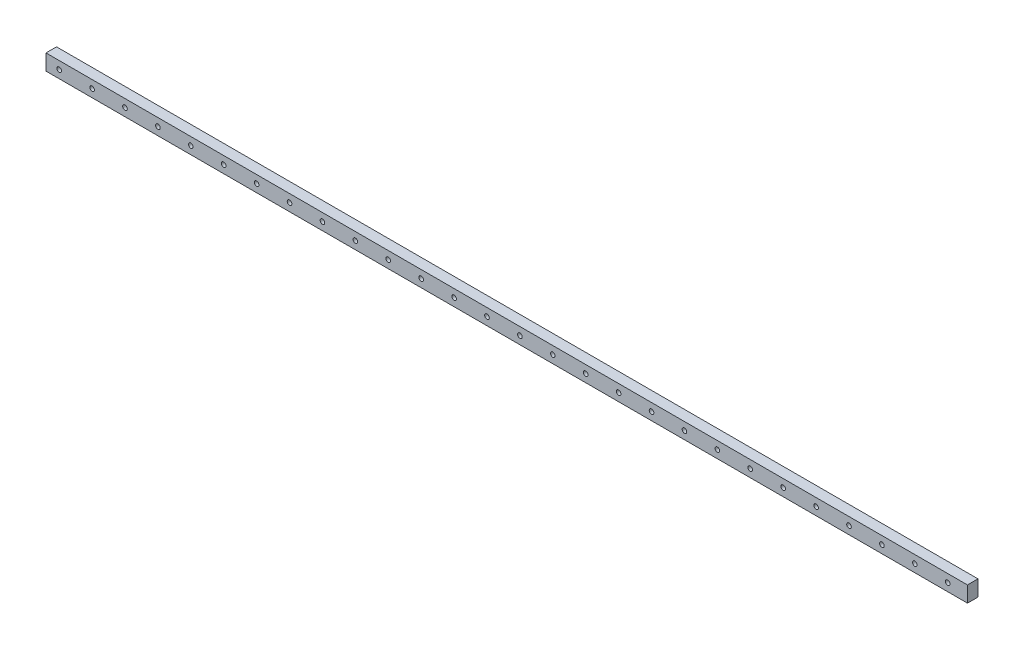
ISO-10303-21;
HEADER;
FILE_DESCRIPTION(('STEP AP214'),'2;1');
FILE_NAME('part.step','',(''),(''),'','','');
FILE_SCHEMA(('AUTOMOTIVE_DESIGN { 1 0 10303 214 1 1 1 1 }'));
ENDSEC;
DATA;
#1=APPLICATION_CONTEXT('core data for automotive mechanical design processes');
#2=APPLICATION_PROTOCOL_DEFINITION('international standard','automotive_design',2000,#1);
#3=PRODUCT_CONTEXT('',#1,'mechanical');
#4=PRODUCT('Part','Part','',(#3));
#5=PRODUCT_RELATED_PRODUCT_CATEGORY('part','',(#4));
#6=PRODUCT_DEFINITION_FORMATION('','',#4);
#7=PRODUCT_DEFINITION_CONTEXT('part definition',#1,'design');
#8=PRODUCT_DEFINITION('design','',#6,#7);
#9=PRODUCT_DEFINITION_SHAPE('','',#8);
#10=(LENGTH_UNIT() NAMED_UNIT(*) SI_UNIT(.MILLI.,.METRE.));
#11=(NAMED_UNIT(*) PLANE_ANGLE_UNIT() SI_UNIT($,.RADIAN.));
#12=(NAMED_UNIT(*) SI_UNIT($,.STERADIAN.) SOLID_ANGLE_UNIT());
#13=UNCERTAINTY_MEASURE_WITH_UNIT(LENGTH_MEASURE(1.E-05),#10,'distance_accuracy_value','');
#14=(GEOMETRIC_REPRESENTATION_CONTEXT(3) GLOBAL_UNCERTAINTY_ASSIGNED_CONTEXT((#13)) GLOBAL_UNIT_ASSIGNED_CONTEXT((#10,
#11,#12)) REPRESENTATION_CONTEXT('',''));
#15=CARTESIAN_POINT('',(0.,0.,0.));
#16=DIRECTION('',(0.,0.,1.));
#17=DIRECTION('',(1.,0.,0.));
#18=AXIS2_PLACEMENT_3D('',#15,#16,#17);
#19=CARTESIAN_POINT('',(335.,0.,-1.));
#20=DIRECTION('',(0.,0.,1.));
#21=DIRECTION('',(0.,-1.,0.));
#22=AXIS2_PLACEMENT_3D('',#19,#20,#21);
#23=CYLINDRICAL_SURFACE('',#22,1.75);
#24=CARTESIAN_POINT('',(335.,0.,8.));
#25=DIRECTION('',(0.,0.,1.));
#26=DIRECTION('',(0.,-1.,0.));
#27=AXIS2_PLACEMENT_3D('',#24,#25,#26);
#28=CIRCLE('',#27,1.75);
#29=CARTESIAN_POINT('',(335.,-1.74999999999996,8.));
#30=VERTEX_POINT('',#29);
#31=EDGE_CURVE('E77',#30,#30,#28,.T.);
#32=ORIENTED_EDGE('',*,*,#31,.T.);
#33=EDGE_LOOP('',(#32));
#34=FACE_BOUND('',#33,.T.);
#35=CARTESIAN_POINT('',(335.,0.,0.));
#36=DIRECTION('',(0.,0.,1.));
#37=DIRECTION('',(0.,-1.,0.));
#38=AXIS2_PLACEMENT_3D('',#35,#36,#37);
#39=CIRCLE('',#38,1.75);
#40=CARTESIAN_POINT('',(335.,-1.74999999999996,0.));
#41=VERTEX_POINT('',#40);
#42=EDGE_CURVE('E10',#41,#41,#39,.T.);
#43=ORIENTED_EDGE('',*,*,#42,.F.);
#44=EDGE_LOOP('',(#43));
#45=FACE_BOUND('',#44,.T.);
#46=ADVANCED_FACE('F16',(#34,#45),#23,.F.);
#47=CARTESIAN_POINT('',(310.,0.,-1.));
#48=DIRECTION('',(0.,0.,1.));
#49=DIRECTION('',(0.,-1.,0.));
#50=AXIS2_PLACEMENT_3D('',#47,#48,#49);
#51=CYLINDRICAL_SURFACE('',#50,1.75);
#52=CARTESIAN_POINT('',(310.,0.,8.));
#53=DIRECTION('',(0.,0.,1.));
#54=DIRECTION('',(0.,-1.,0.));
#55=AXIS2_PLACEMENT_3D('',#52,#53,#54);
#56=CIRCLE('',#55,1.75);
#57=CARTESIAN_POINT('',(310.,-1.74999999999997,8.));
#58=VERTEX_POINT('',#57);
#59=EDGE_CURVE('E232',#58,#58,#56,.T.);
#60=ORIENTED_EDGE('',*,*,#59,.T.);
#61=EDGE_LOOP('',(#60));
#62=FACE_BOUND('',#61,.T.);
#63=CARTESIAN_POINT('',(310.,0.,0.));
#64=DIRECTION('',(0.,0.,1.));
#65=DIRECTION('',(0.,-1.,0.));
#66=AXIS2_PLACEMENT_3D('',#63,#64,#65);
#67=CIRCLE('',#66,1.75);
#68=CARTESIAN_POINT('',(310.,-1.74999999999997,0.));
#69=VERTEX_POINT('',#68);
#70=EDGE_CURVE('E24',#69,#69,#67,.T.);
#71=ORIENTED_EDGE('',*,*,#70,.F.);
#72=EDGE_LOOP('',(#71));
#73=FACE_BOUND('',#72,.T.);
#74=ADVANCED_FACE('F335',(#62,#73),#51,.F.);
#75=CARTESIAN_POINT('',(285.,0.,-1.));
#76=DIRECTION('',(0.,0.,1.));
#77=DIRECTION('',(0.,-1.,0.));
#78=AXIS2_PLACEMENT_3D('',#75,#76,#77);
#79=CYLINDRICAL_SURFACE('',#78,1.75);
#80=CARTESIAN_POINT('',(285.,0.,8.));
#81=DIRECTION('',(0.,0.,1.));
#82=DIRECTION('',(0.,-1.,0.));
#83=AXIS2_PLACEMENT_3D('',#80,#81,#82);
#84=CIRCLE('',#83,1.75);
#85=CARTESIAN_POINT('',(285.,-1.74999999999997,8.));
#86=VERTEX_POINT('',#85);
#87=EDGE_CURVE('E228',#86,#86,#84,.T.);
#88=ORIENTED_EDGE('',*,*,#87,.T.);
#89=EDGE_LOOP('',(#88));
#90=FACE_BOUND('',#89,.T.);
#91=CARTESIAN_POINT('',(285.,0.,0.));
#92=DIRECTION('',(0.,0.,1.));
#93=DIRECTION('',(0.,-1.,0.));
#94=AXIS2_PLACEMENT_3D('',#91,#92,#93);
#95=CIRCLE('',#94,1.75);
#96=CARTESIAN_POINT('',(285.,-1.74999999999997,0.));
#97=VERTEX_POINT('',#96);
#98=EDGE_CURVE('E147',#97,#97,#95,.T.);
#99=ORIENTED_EDGE('',*,*,#98,.F.);
#100=EDGE_LOOP('',(#99));
#101=FACE_BOUND('',#100,.T.);
#102=ADVANCED_FACE('F337',(#90,#101),#79,.F.);
#103=CARTESIAN_POINT('',(260.,0.,-1.));
#104=DIRECTION('',(0.,0.,1.));
#105=DIRECTION('',(0.,-1.,0.));
#106=AXIS2_PLACEMENT_3D('',#103,#104,#105);
#107=CYLINDRICAL_SURFACE('',#106,1.75);
#108=CARTESIAN_POINT('',(260.,0.,8.));
#109=DIRECTION('',(0.,0.,1.));
#110=DIRECTION('',(0.,-1.,0.));
#111=AXIS2_PLACEMENT_3D('',#108,#109,#110);
#112=CIRCLE('',#111,1.75);
#113=CARTESIAN_POINT('',(260.,-1.74999999999997,8.));
#114=VERTEX_POINT('',#113);
#115=EDGE_CURVE('E233',#114,#114,#112,.T.);
#116=ORIENTED_EDGE('',*,*,#115,.T.);
#117=EDGE_LOOP('',(#116));
#118=FACE_BOUND('',#117,.T.);
#119=CARTESIAN_POINT('',(260.,0.,0.));
#120=DIRECTION('',(0.,0.,1.));
#121=DIRECTION('',(0.,-1.,0.));
#122=AXIS2_PLACEMENT_3D('',#119,#120,#121);
#123=CIRCLE('',#122,1.75);
#124=CARTESIAN_POINT('',(260.,-1.74999999999997,0.));
#125=VERTEX_POINT('',#124);
#126=EDGE_CURVE('E151',#125,#125,#123,.T.);
#127=ORIENTED_EDGE('',*,*,#126,.F.);
#128=EDGE_LOOP('',(#127));
#129=FACE_BOUND('',#128,.T.);
#130=ADVANCED_FACE('F344',(#118,#129),#107,.F.);
#131=CARTESIAN_POINT('',(235.,0.,-1.));
#132=DIRECTION('',(0.,0.,1.));
#133=DIRECTION('',(0.,-1.,0.));
#134=AXIS2_PLACEMENT_3D('',#131,#132,#133);
#135=CYLINDRICAL_SURFACE('',#134,1.75);
#136=CARTESIAN_POINT('',(235.,0.,8.));
#137=DIRECTION('',(0.,0.,1.));
#138=DIRECTION('',(0.,-1.,0.));
#139=AXIS2_PLACEMENT_3D('',#136,#137,#138);
#140=CIRCLE('',#139,1.75);
#141=CARTESIAN_POINT('',(235.,-1.74999999999997,8.));
#142=VERTEX_POINT('',#141);
#143=EDGE_CURVE('E250',#142,#142,#140,.T.);
#144=ORIENTED_EDGE('',*,*,#143,.T.);
#145=EDGE_LOOP('',(#144));
#146=FACE_BOUND('',#145,.T.);
#147=CARTESIAN_POINT('',(235.,0.,0.));
#148=DIRECTION('',(0.,0.,1.));
#149=DIRECTION('',(0.,-1.,0.));
#150=AXIS2_PLACEMENT_3D('',#147,#148,#149);
#151=CIRCLE('',#150,1.75);
#152=CARTESIAN_POINT('',(235.,-1.74999999999997,0.));
#153=VERTEX_POINT('',#152);
#154=EDGE_CURVE('E216',#153,#153,#151,.T.);
#155=ORIENTED_EDGE('',*,*,#154,.F.);
#156=EDGE_LOOP('',(#155));
#157=FACE_BOUND('',#156,.T.);
#158=ADVANCED_FACE('F351',(#146,#157),#135,.F.);
#159=CARTESIAN_POINT('',(210.,0.,-1.));
#160=DIRECTION('',(0.,0.,1.));
#161=DIRECTION('',(0.,-1.,0.));
#162=AXIS2_PLACEMENT_3D('',#159,#160,#161);
#163=CYLINDRICAL_SURFACE('',#162,1.75);
#164=CARTESIAN_POINT('',(210.,0.,8.));
#165=DIRECTION('',(0.,0.,1.));
#166=DIRECTION('',(0.,-1.,0.));
#167=AXIS2_PLACEMENT_3D('',#164,#165,#166);
#168=CIRCLE('',#167,1.75);
#169=CARTESIAN_POINT('',(210.,-1.74999999999998,8.));
#170=VERTEX_POINT('',#169);
#171=EDGE_CURVE('E246',#170,#170,#168,.T.);
#172=ORIENTED_EDGE('',*,*,#171,.T.);
#173=EDGE_LOOP('',(#172));
#174=FACE_BOUND('',#173,.T.);
#175=CARTESIAN_POINT('',(210.,0.,0.));
#176=DIRECTION('',(0.,0.,1.));
#177=DIRECTION('',(0.,-1.,0.));
#178=AXIS2_PLACEMENT_3D('',#175,#176,#177);
#179=CIRCLE('',#178,1.75);
#180=CARTESIAN_POINT('',(210.,-1.74999999999998,0.));
#181=VERTEX_POINT('',#180);
#182=EDGE_CURVE('E163',#181,#181,#179,.T.);
#183=ORIENTED_EDGE('',*,*,#182,.F.);
#184=EDGE_LOOP('',(#183));
#185=FACE_BOUND('',#184,.T.);
#186=ADVANCED_FACE('F355',(#174,#185),#163,.F.);
#187=CARTESIAN_POINT('',(185.,0.,-1.));
#188=DIRECTION('',(0.,0.,1.));
#189=DIRECTION('',(0.,-1.,0.));
#190=AXIS2_PLACEMENT_3D('',#187,#188,#189);
#191=CYLINDRICAL_SURFACE('',#190,1.75);
#192=CARTESIAN_POINT('',(185.,0.,8.));
#193=DIRECTION('',(0.,0.,1.));
#194=DIRECTION('',(0.,-1.,0.));
#195=AXIS2_PLACEMENT_3D('',#192,#193,#194);
#196=CIRCLE('',#195,1.75);
#197=CARTESIAN_POINT('',(185.,-1.74999999999998,8.));
#198=VERTEX_POINT('',#197);
#199=EDGE_CURVE('E242',#198,#198,#196,.T.);
#200=ORIENTED_EDGE('',*,*,#199,.T.);
#201=EDGE_LOOP('',(#200));
#202=FACE_BOUND('',#201,.T.);
#203=CARTESIAN_POINT('',(185.,0.,0.));
#204=DIRECTION('',(0.,0.,1.));
#205=DIRECTION('',(0.,-1.,0.));
#206=AXIS2_PLACEMENT_3D('',#203,#204,#205);
#207=CIRCLE('',#206,1.75);
#208=CARTESIAN_POINT('',(185.,-1.74999999999998,0.));
#209=VERTEX_POINT('',#208);
#210=EDGE_CURVE('E133',#209,#209,#207,.T.);
#211=ORIENTED_EDGE('',*,*,#210,.F.);
#212=EDGE_LOOP('',(#211));
#213=FACE_BOUND('',#212,.T.);
#214=ADVANCED_FACE('F359',(#202,#213),#191,.F.);
#215=CARTESIAN_POINT('',(160.,0.,-1.));
#216=DIRECTION('',(0.,0.,1.));
#217=DIRECTION('',(0.,-1.,0.));
#218=AXIS2_PLACEMENT_3D('',#215,#216,#217);
#219=CYLINDRICAL_SURFACE('',#218,1.75);
#220=CARTESIAN_POINT('',(160.,0.,8.));
#221=DIRECTION('',(0.,0.,1.));
#222=DIRECTION('',(0.,-1.,0.));
#223=AXIS2_PLACEMENT_3D('',#220,#221,#222);
#224=CIRCLE('',#223,1.75);
#225=CARTESIAN_POINT('',(160.,-1.74999999999998,8.));
#226=VERTEX_POINT('',#225);
#227=EDGE_CURVE('E241',#226,#226,#224,.T.);
#228=ORIENTED_EDGE('',*,*,#227,.T.);
#229=EDGE_LOOP('',(#228));
#230=FACE_BOUND('',#229,.T.);
#231=CARTESIAN_POINT('',(160.,0.,0.));
#232=DIRECTION('',(0.,0.,1.));
#233=DIRECTION('',(0.,-1.,0.));
#234=AXIS2_PLACEMENT_3D('',#231,#232,#233);
#235=CIRCLE('',#234,1.75);
#236=CARTESIAN_POINT('',(160.,-1.74999999999998,0.));
#237=VERTEX_POINT('',#236);
#238=EDGE_CURVE('E129',#237,#237,#235,.T.);
#239=ORIENTED_EDGE('',*,*,#238,.F.);
#240=EDGE_LOOP('',(#239));
#241=FACE_BOUND('',#240,.T.);
#242=ADVANCED_FACE('F365',(#230,#241),#219,.F.);
#243=CARTESIAN_POINT('',(135.,0.,-1.));
#244=DIRECTION('',(0.,0.,1.));
#245=DIRECTION('',(0.,-1.,0.));
#246=AXIS2_PLACEMENT_3D('',#243,#244,#245);
#247=CYLINDRICAL_SURFACE('',#246,1.75);
#248=CARTESIAN_POINT('',(135.,0.,8.));
#249=DIRECTION('',(0.,0.,1.));
#250=DIRECTION('',(0.,-1.,0.));
#251=AXIS2_PLACEMENT_3D('',#248,#249,#250);
#252=CIRCLE('',#251,1.75);
#253=CARTESIAN_POINT('',(135.,-1.74999999999999,8.));
#254=VERTEX_POINT('',#253);
#255=EDGE_CURVE('E237',#254,#254,#252,.T.);
#256=ORIENTED_EDGE('',*,*,#255,.T.);
#257=EDGE_LOOP('',(#256));
#258=FACE_BOUND('',#257,.T.);
#259=CARTESIAN_POINT('',(135.,0.,0.));
#260=DIRECTION('',(0.,0.,1.));
#261=DIRECTION('',(0.,-1.,0.));
#262=AXIS2_PLACEMENT_3D('',#259,#260,#261);
#263=CIRCLE('',#262,1.75);
#264=CARTESIAN_POINT('',(135.,-1.74999999999999,0.));
#265=VERTEX_POINT('',#264);
#266=EDGE_CURVE('E134',#265,#265,#263,.T.);
#267=ORIENTED_EDGE('',*,*,#266,.F.);
#268=EDGE_LOOP('',(#267));
#269=FACE_BOUND('',#268,.T.);
#270=ADVANCED_FACE('F361',(#258,#269),#247,.F.);
#271=CARTESIAN_POINT('',(110.,0.,-1.));
#272=DIRECTION('',(0.,0.,1.));
#273=DIRECTION('',(0.,-1.,0.));
#274=AXIS2_PLACEMENT_3D('',#271,#272,#273);
#275=CYLINDRICAL_SURFACE('',#274,1.75);
#276=CARTESIAN_POINT('',(110.,0.,8.));
#277=DIRECTION('',(0.,0.,1.));
#278=DIRECTION('',(0.,-1.,0.));
#279=AXIS2_PLACEMENT_3D('',#276,#277,#278);
#280=CIRCLE('',#279,1.75);
#281=CARTESIAN_POINT('',(110.,-1.74999999999999,8.));
#282=VERTEX_POINT('',#281);
#283=EDGE_CURVE('E227',#282,#282,#280,.T.);
#284=ORIENTED_EDGE('',*,*,#283,.T.);
#285=EDGE_LOOP('',(#284));
#286=FACE_BOUND('',#285,.T.);
#287=CARTESIAN_POINT('',(110.,0.,0.));
#288=DIRECTION('',(0.,0.,1.));
#289=DIRECTION('',(0.,-1.,0.));
#290=AXIS2_PLACEMENT_3D('',#287,#288,#289);
#291=CIRCLE('',#290,1.75);
#292=CARTESIAN_POINT('',(110.,-1.74999999999999,0.));
#293=VERTEX_POINT('',#292);
#294=EDGE_CURVE('E287',#293,#293,#291,.T.);
#295=ORIENTED_EDGE('',*,*,#294,.F.);
#296=EDGE_LOOP('',(#295));
#297=FACE_BOUND('',#296,.T.);
#298=ADVANCED_FACE('F364',(#286,#297),#275,.F.);
#299=CARTESIAN_POINT('',(85.,0.,-1.));
#300=DIRECTION('',(0.,0.,1.));
#301=DIRECTION('',(0.,-1.,0.));
#302=AXIS2_PLACEMENT_3D('',#299,#300,#301);
#303=CYLINDRICAL_SURFACE('',#302,1.75);
#304=CARTESIAN_POINT('',(85.,0.,8.));
#305=DIRECTION('',(0.,0.,1.));
#306=DIRECTION('',(0.,-1.,0.));
#307=AXIS2_PLACEMENT_3D('',#304,#305,#306);
#308=CIRCLE('',#307,1.75);
#309=CARTESIAN_POINT('',(85.,-1.74999999999999,8.));
#310=VERTEX_POINT('',#309);
#311=EDGE_CURVE('E223',#310,#310,#308,.T.);
#312=ORIENTED_EDGE('',*,*,#311,.T.);
#313=EDGE_LOOP('',(#312));
#314=FACE_BOUND('',#313,.T.);
#315=CARTESIAN_POINT('',(85.,0.,0.));
#316=DIRECTION('',(0.,0.,1.));
#317=DIRECTION('',(0.,-1.,0.));
#318=AXIS2_PLACEMENT_3D('',#315,#316,#317);
#319=CIRCLE('',#318,1.75);
#320=CARTESIAN_POINT('',(85.,-1.74999999999999,0.));
#321=VERTEX_POINT('',#320);
#322=EDGE_CURVE('E198',#321,#321,#319,.T.);
#323=ORIENTED_EDGE('',*,*,#322,.F.);
#324=EDGE_LOOP('',(#323));
#325=FACE_BOUND('',#324,.T.);
#326=ADVANCED_FACE('F367',(#314,#325),#303,.F.);
#327=CARTESIAN_POINT('',(60.,0.,-1.));
#328=DIRECTION('',(0.,0.,1.));
#329=DIRECTION('',(0.,-1.,0.));
#330=AXIS2_PLACEMENT_3D('',#327,#328,#329);
#331=CYLINDRICAL_SURFACE('',#330,1.75);
#332=CARTESIAN_POINT('',(60.,0.,8.));
#333=DIRECTION('',(0.,0.,1.));
#334=DIRECTION('',(0.,-1.,0.));
#335=AXIS2_PLACEMENT_3D('',#332,#333,#334);
#336=CIRCLE('',#335,1.75);
#337=CARTESIAN_POINT('',(60.,-1.74999999999999,8.));
#338=VERTEX_POINT('',#337);
#339=EDGE_CURVE('E215',#338,#338,#336,.T.);
#340=ORIENTED_EDGE('',*,*,#339,.T.);
#341=EDGE_LOOP('',(#340));
#342=FACE_BOUND('',#341,.T.);
#343=CARTESIAN_POINT('',(60.,0.,0.));
#344=DIRECTION('',(0.,0.,1.));
#345=DIRECTION('',(0.,-1.,0.));
#346=AXIS2_PLACEMENT_3D('',#343,#344,#345);
#347=CIRCLE('',#346,1.75);
#348=CARTESIAN_POINT('',(60.,-1.74999999999999,0.));
#349=VERTEX_POINT('',#348);
#350=EDGE_CURVE('E194',#349,#349,#347,.T.);
#351=ORIENTED_EDGE('',*,*,#350,.F.);
#352=EDGE_LOOP('',(#351));
#353=FACE_BOUND('',#352,.T.);
#354=ADVANCED_FACE('F370',(#342,#353),#331,.F.);
#355=CARTESIAN_POINT('',(35.,0.,-1.));
#356=DIRECTION('',(0.,0.,1.));
#357=DIRECTION('',(0.,-1.,0.));
#358=AXIS2_PLACEMENT_3D('',#355,#356,#357);
#359=CYLINDRICAL_SURFACE('',#358,1.75);
#360=CARTESIAN_POINT('',(35.,0.,8.));
#361=DIRECTION('',(0.,0.,1.));
#362=DIRECTION('',(0.,-1.,0.));
#363=AXIS2_PLACEMENT_3D('',#360,#361,#362);
#364=CIRCLE('',#363,1.75);
#365=CARTESIAN_POINT('',(35.,-1.75,8.));
#366=VERTEX_POINT('',#365);
#367=EDGE_CURVE('E168',#366,#366,#364,.T.);
#368=ORIENTED_EDGE('',*,*,#367,.T.);
#369=EDGE_LOOP('',(#368));
#370=FACE_BOUND('',#369,.T.);
#371=CARTESIAN_POINT('',(35.,0.,0.));
#372=DIRECTION('',(0.,0.,1.));
#373=DIRECTION('',(0.,-1.,0.));
#374=AXIS2_PLACEMENT_3D('',#371,#372,#373);
#375=CIRCLE('',#374,1.75);
#376=CARTESIAN_POINT('',(35.,-1.75,0.));
#377=VERTEX_POINT('',#376);
#378=EDGE_CURVE('E199',#377,#377,#375,.T.);
#379=ORIENTED_EDGE('',*,*,#378,.F.);
#380=EDGE_LOOP('',(#379));
#381=FACE_BOUND('',#380,.T.);
#382=ADVANCED_FACE('F374',(#370,#381),#359,.F.);
#383=CARTESIAN_POINT('',(10.,0.,-1.));
#384=DIRECTION('',(0.,0.,1.));
#385=DIRECTION('',(0.,-1.,0.));
#386=AXIS2_PLACEMENT_3D('',#383,#384,#385);
#387=CYLINDRICAL_SURFACE('',#386,1.75);
#388=CARTESIAN_POINT('',(10.,0.,8.));
#389=DIRECTION('',(0.,0.,1.));
#390=DIRECTION('',(0.,-1.,0.));
#391=AXIS2_PLACEMENT_3D('',#388,#389,#390);
#392=CIRCLE('',#391,1.75);
#393=CARTESIAN_POINT('',(10.,-1.75,8.));
#394=VERTEX_POINT('',#393);
#395=EDGE_CURVE('E164',#394,#394,#392,.T.);
#396=ORIENTED_EDGE('',*,*,#395,.T.);
#397=EDGE_LOOP('',(#396));
#398=FACE_BOUND('',#397,.T.);
#399=CARTESIAN_POINT('',(10.,0.,0.));
#400=DIRECTION('',(0.,0.,1.));
#401=DIRECTION('',(0.,-1.,0.));
#402=AXIS2_PLACEMENT_3D('',#399,#400,#401);
#403=CIRCLE('',#402,1.75);
#404=CARTESIAN_POINT('',(10.,-1.75,0.));
#405=VERTEX_POINT('',#404);
#406=EDGE_CURVE('E270',#405,#405,#403,.T.);
#407=ORIENTED_EDGE('',*,*,#406,.F.);
#408=EDGE_LOOP('',(#407));
#409=FACE_BOUND('',#408,.T.);
#410=ADVANCED_FACE('F378',(#398,#409),#387,.F.);
#411=CARTESIAN_POINT('',(-15.,0.,-1.));
#412=DIRECTION('',(0.,0.,1.));
#413=DIRECTION('',(0.,-1.,0.));
#414=AXIS2_PLACEMENT_3D('',#411,#412,#413);
#415=CYLINDRICAL_SURFACE('',#414,1.75);
#416=CARTESIAN_POINT('',(-15.,0.,8.));
#417=DIRECTION('',(0.,0.,1.));
#418=DIRECTION('',(0.,-1.,0.));
#419=AXIS2_PLACEMENT_3D('',#416,#417,#418);
#420=CIRCLE('',#419,1.75);
#421=CARTESIAN_POINT('',(-15.,-1.75,8.));
#422=VERTEX_POINT('',#421);
#423=EDGE_CURVE('E169',#422,#422,#420,.T.);
#424=ORIENTED_EDGE('',*,*,#423,.T.);
#425=EDGE_LOOP('',(#424));
#426=FACE_BOUND('',#425,.T.);
#427=CARTESIAN_POINT('',(-15.,0.,0.));
#428=DIRECTION('',(0.,0.,1.));
#429=DIRECTION('',(0.,-1.,0.));
#430=AXIS2_PLACEMENT_3D('',#427,#428,#429);
#431=CIRCLE('',#430,1.75);
#432=CARTESIAN_POINT('',(-15.,-1.75,0.));
#433=VERTEX_POINT('',#432);
#434=EDGE_CURVE('E274',#433,#433,#431,.T.);
#435=ORIENTED_EDGE('',*,*,#434,.F.);
#436=EDGE_LOOP('',(#435));
#437=FACE_BOUND('',#436,.T.);
#438=ADVANCED_FACE('F382',(#426,#437),#415,.F.);
#439=CARTESIAN_POINT('',(-40.,0.,-1.));
#440=DIRECTION('',(0.,0.,1.));
#441=DIRECTION('',(0.,-1.,0.));
#442=AXIS2_PLACEMENT_3D('',#439,#440,#441);
#443=CYLINDRICAL_SURFACE('',#442,1.75);
#444=CARTESIAN_POINT('',(-40.,0.,8.));
#445=DIRECTION('',(0.,0.,1.));
#446=DIRECTION('',(0.,-1.,0.));
#447=AXIS2_PLACEMENT_3D('',#444,#445,#446);
#448=CIRCLE('',#447,1.75);
#449=CARTESIAN_POINT('',(-40.,-1.75,8.));
#450=VERTEX_POINT('',#449);
#451=EDGE_CURVE('E185',#450,#450,#448,.T.);
#452=ORIENTED_EDGE('',*,*,#451,.T.);
#453=EDGE_LOOP('',(#452));
#454=FACE_BOUND('',#453,.T.);
#455=CARTESIAN_POINT('',(-40.,0.,0.));
#456=DIRECTION('',(0.,0.,1.));
#457=DIRECTION('',(0.,-1.,0.));
#458=AXIS2_PLACEMENT_3D('',#455,#456,#457);
#459=CIRCLE('',#458,1.75);
#460=CARTESIAN_POINT('',(-40.,-1.75,0.));
#461=VERTEX_POINT('',#460);
#462=EDGE_CURVE('E280',#461,#461,#459,.T.);
#463=ORIENTED_EDGE('',*,*,#462,.F.);
#464=EDGE_LOOP('',(#463));
#465=FACE_BOUND('',#464,.T.);
#466=ADVANCED_FACE('F389',(#454,#465),#443,.F.);
#467=CARTESIAN_POINT('',(-65.,0.,-1.));
#468=DIRECTION('',(0.,0.,1.));
#469=DIRECTION('',(0.,-1.,0.));
#470=AXIS2_PLACEMENT_3D('',#467,#468,#469);
#471=CYLINDRICAL_SURFACE('',#470,1.75);
#472=CARTESIAN_POINT('',(-65.,0.,8.));
#473=DIRECTION('',(0.,0.,1.));
#474=DIRECTION('',(0.,-1.,0.));
#475=AXIS2_PLACEMENT_3D('',#472,#473,#474);
#476=CIRCLE('',#475,1.75);
#477=CARTESIAN_POINT('',(-65.,-1.75000000000001,8.));
#478=VERTEX_POINT('',#477);
#479=EDGE_CURVE('E203',#478,#478,#476,.T.);
#480=ORIENTED_EDGE('',*,*,#479,.T.);
#481=EDGE_LOOP('',(#480));
#482=FACE_BOUND('',#481,.T.);
#483=CARTESIAN_POINT('',(-65.,0.,0.));
#484=DIRECTION('',(0.,0.,1.));
#485=DIRECTION('',(0.,-1.,0.));
#486=AXIS2_PLACEMENT_3D('',#483,#484,#485);
#487=CIRCLE('',#486,1.75);
#488=CARTESIAN_POINT('',(-65.,-1.75000000000001,0.));
#489=VERTEX_POINT('',#488);
#490=EDGE_CURVE('E307',#489,#489,#487,.T.);
#491=ORIENTED_EDGE('',*,*,#490,.F.);
#492=EDGE_LOOP('',(#491));
#493=FACE_BOUND('',#492,.T.);
#494=ADVANCED_FACE('F393',(#482,#493),#471,.F.);
#495=CARTESIAN_POINT('',(-90.,0.,-1.));
#496=DIRECTION('',(0.,0.,1.));
#497=DIRECTION('',(0.,-1.,0.));
#498=AXIS2_PLACEMENT_3D('',#495,#496,#497);
#499=CYLINDRICAL_SURFACE('',#498,1.75);
#500=CARTESIAN_POINT('',(-90.,0.,8.));
#501=DIRECTION('',(0.,0.,1.));
#502=DIRECTION('',(0.,-1.,0.));
#503=AXIS2_PLACEMENT_3D('',#500,#501,#502);
#504=CIRCLE('',#503,1.75);
#505=CARTESIAN_POINT('',(-90.,-1.75000000000001,8.));
#506=VERTEX_POINT('',#505);
#507=EDGE_CURVE('E193',#506,#506,#504,.T.);
#508=ORIENTED_EDGE('',*,*,#507,.T.);
#509=EDGE_LOOP('',(#508));
#510=FACE_BOUND('',#509,.T.);
#511=CARTESIAN_POINT('',(-90.,0.,0.));
#512=DIRECTION('',(0.,0.,1.));
#513=DIRECTION('',(0.,-1.,0.));
#514=AXIS2_PLACEMENT_3D('',#511,#512,#513);
#515=CIRCLE('',#514,1.75);
#516=CARTESIAN_POINT('',(-90.,-1.75000000000001,0.));
#517=VERTEX_POINT('',#516);
#518=EDGE_CURVE('E303',#517,#517,#515,.T.);
#519=ORIENTED_EDGE('',*,*,#518,.F.);
#520=EDGE_LOOP('',(#519));
#521=FACE_BOUND('',#520,.T.);
#522=ADVANCED_FACE('F395',(#510,#521),#499,.F.);
#523=CARTESIAN_POINT('',(-115.,0.,-1.));
#524=DIRECTION('',(0.,0.,1.));
#525=DIRECTION('',(0.,-1.,0.));
#526=AXIS2_PLACEMENT_3D('',#523,#524,#525);
#527=CYLINDRICAL_SURFACE('',#526,1.75);
#528=CARTESIAN_POINT('',(-115.,0.,8.));
#529=DIRECTION('',(0.,0.,1.));
#530=DIRECTION('',(0.,-1.,0.));
#531=AXIS2_PLACEMENT_3D('',#528,#529,#530);
#532=CIRCLE('',#531,1.75);
#533=CARTESIAN_POINT('',(-115.,-1.75000000000001,8.));
#534=VERTEX_POINT('',#533);
#535=EDGE_CURVE('E189',#534,#534,#532,.T.);
#536=ORIENTED_EDGE('',*,*,#535,.T.);
#537=EDGE_LOOP('',(#536));
#538=FACE_BOUND('',#537,.T.);
#539=CARTESIAN_POINT('',(-115.,0.,0.));
#540=DIRECTION('',(0.,0.,1.));
#541=DIRECTION('',(0.,-1.,0.));
#542=AXIS2_PLACEMENT_3D('',#539,#540,#541);
#543=CIRCLE('',#542,1.75);
#544=CARTESIAN_POINT('',(-115.,-1.75000000000001,0.));
#545=VERTEX_POINT('',#544);
#546=EDGE_CURVE('E124',#545,#545,#543,.T.);
#547=ORIENTED_EDGE('',*,*,#546,.F.);
#548=EDGE_LOOP('',(#547));
#549=FACE_BOUND('',#548,.T.);
#550=ADVANCED_FACE('F398',(#538,#549),#527,.F.);
#551=CARTESIAN_POINT('',(-140.,0.,-1.));
#552=DIRECTION('',(0.,0.,1.));
#553=DIRECTION('',(0.,-1.,0.));
#554=AXIS2_PLACEMENT_3D('',#551,#552,#553);
#555=CYLINDRICAL_SURFACE('',#554,1.75);
#556=CARTESIAN_POINT('',(-140.,0.,8.));
#557=DIRECTION('',(0.,0.,1.));
#558=DIRECTION('',(0.,-1.,0.));
#559=AXIS2_PLACEMENT_3D('',#556,#557,#558);
#560=CIRCLE('',#559,1.75);
#561=CARTESIAN_POINT('',(-140.,-1.75000000000002,8.));
#562=VERTEX_POINT('',#561);
#563=EDGE_CURVE('E181',#562,#562,#560,.T.);
#564=ORIENTED_EDGE('',*,*,#563,.T.);
#565=EDGE_LOOP('',(#564));
#566=FACE_BOUND('',#565,.T.);
#567=CARTESIAN_POINT('',(-140.,0.,0.));
#568=DIRECTION('',(0.,0.,1.));
#569=DIRECTION('',(0.,-1.,0.));
#570=AXIS2_PLACEMENT_3D('',#567,#568,#569);
#571=CIRCLE('',#570,1.75);
#572=CARTESIAN_POINT('',(-140.,-1.75000000000002,0.));
#573=VERTEX_POINT('',#572);
#574=EDGE_CURVE('E120',#573,#573,#571,.T.);
#575=ORIENTED_EDGE('',*,*,#574,.F.);
#576=EDGE_LOOP('',(#575));
#577=FACE_BOUND('',#576,.T.);
#578=ADVANCED_FACE('F414',(#566,#577),#555,.F.);
#579=CARTESIAN_POINT('',(-165.,0.,-1.));
#580=DIRECTION('',(0.,0.,1.));
#581=DIRECTION('',(0.,-1.,0.));
#582=AXIS2_PLACEMENT_3D('',#579,#580,#581);
#583=CYLINDRICAL_SURFACE('',#582,1.75);
#584=CARTESIAN_POINT('',(-165.,0.,8.));
#585=DIRECTION('',(0.,0.,1.));
#586=DIRECTION('',(0.,-1.,0.));
#587=AXIS2_PLACEMENT_3D('',#584,#585,#586);
#588=CIRCLE('',#587,1.75);
#589=CARTESIAN_POINT('',(-165.,-1.75000000000002,8.));
#590=VERTEX_POINT('',#589);
#591=EDGE_CURVE('E103',#590,#590,#588,.T.);
#592=ORIENTED_EDGE('',*,*,#591,.T.);
#593=EDGE_LOOP('',(#592));
#594=FACE_BOUND('',#593,.T.);
#595=CARTESIAN_POINT('',(-165.,0.,0.));
#596=DIRECTION('',(0.,0.,1.));
#597=DIRECTION('',(0.,-1.,0.));
#598=AXIS2_PLACEMENT_3D('',#595,#596,#597);
#599=CIRCLE('',#598,1.75);
#600=CARTESIAN_POINT('',(-165.,-1.75000000000002,0.));
#601=VERTEX_POINT('',#600);
#602=EDGE_CURVE('E125',#601,#601,#599,.T.);
#603=ORIENTED_EDGE('',*,*,#602,.F.);
#604=EDGE_LOOP('',(#603));
#605=FACE_BOUND('',#604,.T.);
#606=ADVANCED_FACE('F404',(#594,#605),#583,.F.);
#607=CARTESIAN_POINT('',(-190.,0.,-1.));
#608=DIRECTION('',(0.,0.,1.));
#609=DIRECTION('',(0.,-1.,0.));
#610=AXIS2_PLACEMENT_3D('',#607,#608,#609);
#611=CYLINDRICAL_SURFACE('',#610,1.75);
#612=CARTESIAN_POINT('',(-190.,0.,8.));
#613=DIRECTION('',(0.,0.,1.));
#614=DIRECTION('',(0.,-1.,0.));
#615=AXIS2_PLACEMENT_3D('',#612,#613,#614);
#616=CIRCLE('',#615,1.75);
#617=CARTESIAN_POINT('',(-190.,-1.75000000000002,8.));
#618=VERTEX_POINT('',#617);
#619=EDGE_CURVE('E101',#618,#618,#616,.T.);
#620=ORIENTED_EDGE('',*,*,#619,.T.);
#621=EDGE_LOOP('',(#620));
#622=FACE_BOUND('',#621,.T.);
#623=CARTESIAN_POINT('',(-190.,0.,0.));
#624=DIRECTION('',(0.,0.,1.));
#625=DIRECTION('',(0.,-1.,0.));
#626=AXIS2_PLACEMENT_3D('',#623,#624,#625);
#627=CIRCLE('',#626,1.75);
#628=CARTESIAN_POINT('',(-190.,-1.75000000000002,0.));
#629=VERTEX_POINT('',#628);
#630=EDGE_CURVE('E156',#629,#629,#627,.T.);
#631=ORIENTED_EDGE('',*,*,#630,.F.);
#632=EDGE_LOOP('',(#631));
#633=FACE_BOUND('',#632,.T.);
#634=ADVANCED_FACE('F400',(#622,#633),#611,.F.);
#635=CARTESIAN_POINT('',(-215.,0.,-1.));
#636=DIRECTION('',(0.,0.,1.));
#637=DIRECTION('',(0.,-1.,0.));
#638=AXIS2_PLACEMENT_3D('',#635,#636,#637);
#639=CYLINDRICAL_SURFACE('',#638,1.75);
#640=CARTESIAN_POINT('',(-215.,0.,8.));
#641=DIRECTION('',(0.,0.,1.));
#642=DIRECTION('',(0.,-1.,0.));
#643=AXIS2_PLACEMENT_3D('',#640,#641,#642);
#644=CIRCLE('',#643,1.75);
#645=CARTESIAN_POINT('',(-215.,-1.75000000000002,8.));
#646=VERTEX_POINT('',#645);
#647=EDGE_CURVE('E104',#646,#646,#644,.T.);
#648=ORIENTED_EDGE('',*,*,#647,.T.);
#649=EDGE_LOOP('',(#648));
#650=FACE_BOUND('',#649,.T.);
#651=CARTESIAN_POINT('',(-215.,0.,0.));
#652=DIRECTION('',(0.,0.,1.));
#653=DIRECTION('',(0.,-1.,0.));
#654=AXIS2_PLACEMENT_3D('',#651,#652,#653);
#655=CIRCLE('',#654,1.75);
#656=CARTESIAN_POINT('',(-215.,-1.75000000000002,0.));
#657=VERTEX_POINT('',#656);
#658=EDGE_CURVE('E152',#657,#657,#655,.T.);
#659=ORIENTED_EDGE('',*,*,#658,.F.);
#660=EDGE_LOOP('',(#659));
#661=FACE_BOUND('',#660,.T.);
#662=ADVANCED_FACE('F403',(#650,#661),#639,.F.);
#663=CARTESIAN_POINT('',(-240.,0.,-1.));
#664=DIRECTION('',(0.,0.,1.));
#665=DIRECTION('',(0.,-1.,0.));
#666=AXIS2_PLACEMENT_3D('',#663,#664,#665);
#667=CYLINDRICAL_SURFACE('',#666,1.75);
#668=CARTESIAN_POINT('',(-240.,0.,8.));
#669=DIRECTION('',(0.,0.,1.));
#670=DIRECTION('',(0.,-1.,0.));
#671=AXIS2_PLACEMENT_3D('',#668,#669,#670);
#672=CIRCLE('',#671,1.75);
#673=CARTESIAN_POINT('',(-240.,-1.75000000000003,8.));
#674=VERTEX_POINT('',#673);
#675=EDGE_CURVE('E109',#674,#674,#672,.T.);
#676=ORIENTED_EDGE('',*,*,#675,.T.);
#677=EDGE_LOOP('',(#676));
#678=FACE_BOUND('',#677,.T.);
#679=CARTESIAN_POINT('',(-240.,0.,0.));
#680=DIRECTION('',(0.,0.,1.));
#681=DIRECTION('',(0.,-1.,0.));
#682=AXIS2_PLACEMENT_3D('',#679,#680,#681);
#683=CIRCLE('',#682,1.75);
#684=CARTESIAN_POINT('',(-240.,-1.75000000000003,0.));
#685=VERTEX_POINT('',#684);
#686=EDGE_CURVE('E157',#685,#685,#683,.T.);
#687=ORIENTED_EDGE('',*,*,#686,.F.);
#688=EDGE_LOOP('',(#687));
#689=FACE_BOUND('',#688,.T.);
#690=ADVANCED_FACE('F408',(#678,#689),#667,.F.);
#691=CARTESIAN_POINT('',(-265.,0.,-1.));
#692=DIRECTION('',(0.,0.,1.));
#693=DIRECTION('',(0.,-1.,0.));
#694=AXIS2_PLACEMENT_3D('',#691,#692,#693);
#695=CYLINDRICAL_SURFACE('',#694,1.75);
#696=CARTESIAN_POINT('',(-265.,0.,8.));
#697=DIRECTION('',(0.,0.,1.));
#698=DIRECTION('',(0.,-1.,0.));
#699=AXIS2_PLACEMENT_3D('',#696,#697,#698);
#700=CIRCLE('',#699,1.75);
#701=CARTESIAN_POINT('',(-265.,-1.75000000000003,8.));
#702=VERTEX_POINT('',#701);
#703=EDGE_CURVE('E139',#702,#702,#700,.T.);
#704=ORIENTED_EDGE('',*,*,#703,.T.);
#705=EDGE_LOOP('',(#704));
#706=FACE_BOUND('',#705,.T.);
#707=CARTESIAN_POINT('',(-265.,0.,0.));
#708=DIRECTION('',(0.,0.,1.));
#709=DIRECTION('',(0.,-1.,0.));
#710=AXIS2_PLACEMENT_3D('',#707,#708,#709);
#711=CIRCLE('',#710,1.75);
#712=CARTESIAN_POINT('',(-265.,-1.75000000000003,0.));
#713=VERTEX_POINT('',#712);
#714=EDGE_CURVE('E260',#713,#713,#711,.T.);
#715=ORIENTED_EDGE('',*,*,#714,.F.);
#716=EDGE_LOOP('',(#715));
#717=FACE_BOUND('',#716,.T.);
#718=ADVANCED_FACE('F412',(#706,#717),#695,.F.);
#719=CARTESIAN_POINT('',(-290.,0.,-1.));
#720=DIRECTION('',(0.,0.,1.));
#721=DIRECTION('',(0.,-1.,0.));
#722=AXIS2_PLACEMENT_3D('',#719,#720,#721);
#723=CYLINDRICAL_SURFACE('',#722,1.75);
#724=CARTESIAN_POINT('',(-290.,0.,8.));
#725=DIRECTION('',(0.,0.,1.));
#726=DIRECTION('',(0.,-1.,0.));
#727=AXIS2_PLACEMENT_3D('',#724,#725,#726);
#728=CIRCLE('',#727,1.75);
#729=CARTESIAN_POINT('',(-290.,-1.75000000000003,8.));
#730=VERTEX_POINT('',#729);
#731=EDGE_CURVE('E135',#730,#730,#728,.T.);
#732=ORIENTED_EDGE('',*,*,#731,.T.);
#733=EDGE_LOOP('',(#732));
#734=FACE_BOUND('',#733,.T.);
#735=CARTESIAN_POINT('',(-290.,0.,0.));
#736=DIRECTION('',(0.,0.,1.));
#737=DIRECTION('',(0.,-1.,0.));
#738=AXIS2_PLACEMENT_3D('',#735,#736,#737);
#739=CIRCLE('',#738,1.75);
#740=CARTESIAN_POINT('',(-290.,-1.75000000000003,0.));
#741=VERTEX_POINT('',#740);
#742=EDGE_CURVE('E264',#741,#741,#739,.T.);
#743=ORIENTED_EDGE('',*,*,#742,.F.);
#744=EDGE_LOOP('',(#743));
#745=FACE_BOUND('',#744,.T.);
#746=ADVANCED_FACE('F423',(#734,#745),#723,.F.);
#747=CARTESIAN_POINT('',(-315.,0.,-1.));
#748=DIRECTION('',(0.,0.,1.));
#749=DIRECTION('',(0.,-1.,0.));
#750=AXIS2_PLACEMENT_3D('',#747,#748,#749);
#751=CYLINDRICAL_SURFACE('',#750,1.75);
#752=CARTESIAN_POINT('',(-315.,0.,8.));
#753=DIRECTION('',(0.,0.,1.));
#754=DIRECTION('',(0.,-1.,0.));
#755=AXIS2_PLACEMENT_3D('',#752,#753,#754);
#756=CIRCLE('',#755,1.75);
#757=CARTESIAN_POINT('',(-315.,-1.75000000000003,8.));
#758=VERTEX_POINT('',#757);
#759=EDGE_CURVE('E114',#758,#758,#756,.T.);
#760=ORIENTED_EDGE('',*,*,#759,.T.);
#761=EDGE_LOOP('',(#760));
#762=FACE_BOUND('',#761,.T.);
#763=CARTESIAN_POINT('',(-315.,0.,0.));
#764=DIRECTION('',(0.,0.,1.));
#765=DIRECTION('',(0.,-1.,0.));
#766=AXIS2_PLACEMENT_3D('',#763,#764,#765);
#767=CIRCLE('',#766,1.75);
#768=CARTESIAN_POINT('',(-315.,-1.75000000000003,0.));
#769=VERTEX_POINT('',#768);
#770=EDGE_CURVE('E208',#769,#769,#767,.T.);
#771=ORIENTED_EDGE('',*,*,#770,.F.);
#772=EDGE_LOOP('',(#771));
#773=FACE_BOUND('',#772,.T.);
#774=ADVANCED_FACE('F430',(#762,#773),#751,.F.);
#775=CARTESIAN_POINT('',(-340.,0.,-1.));
#776=DIRECTION('',(0.,0.,1.));
#777=DIRECTION('',(0.,-1.,0.));
#778=AXIS2_PLACEMENT_3D('',#775,#776,#777);
#779=CYLINDRICAL_SURFACE('',#778,1.75);
#780=CARTESIAN_POINT('',(-340.,0.,8.));
#781=DIRECTION('',(0.,0.,1.));
#782=DIRECTION('',(0.,-1.,0.));
#783=AXIS2_PLACEMENT_3D('',#780,#781,#782);
#784=CIRCLE('',#783,1.75);
#785=CARTESIAN_POINT('',(-340.,-1.75000000000004,8.));
#786=VERTEX_POINT('',#785);
#787=EDGE_CURVE('E110',#786,#786,#784,.T.);
#788=ORIENTED_EDGE('',*,*,#787,.T.);
#789=EDGE_LOOP('',(#788));
#790=FACE_BOUND('',#789,.T.);
#791=CARTESIAN_POINT('',(-340.,0.,0.));
#792=DIRECTION('',(0.,0.,1.));
#793=DIRECTION('',(0.,-1.,0.));
#794=AXIS2_PLACEMENT_3D('',#791,#792,#793);
#795=CIRCLE('',#794,1.75);
#796=CARTESIAN_POINT('',(-340.,-1.75000000000004,0.));
#797=VERTEX_POINT('',#796);
#798=EDGE_CURVE('E204',#797,#797,#795,.T.);
#799=ORIENTED_EDGE('',*,*,#798,.F.);
#800=EDGE_LOOP('',(#799));
#801=FACE_BOUND('',#800,.T.);
#802=ADVANCED_FACE('F435',(#790,#801),#779,.F.);
#803=CARTESIAN_POINT('',(-350.,-6.,0.));
#804=DIRECTION('',(0.,-1.,0.));
#805=DIRECTION('',(0.,0.,-1.));
#806=AXIS2_PLACEMENT_3D('',#803,#804,#805);
#807=PLANE('',#806);
#808=DIRECTION('',(0.,0.,1.));
#809=VECTOR('',#808,1.);
#810=CARTESIAN_POINT('',(-350.,-6.,0.));
#811=LINE('',#810,#809);
#812=CARTESIAN_POINT('',(-350.,-6.,0.));
#813=VERTEX_POINT('',#812);
#814=CARTESIAN_POINT('',(-350.,-6.,8.));
#815=VERTEX_POINT('',#814);
#816=EDGE_CURVE('E128',#813,#815,#811,.T.);
#817=ORIENTED_EDGE('',*,*,#816,.F.);
#818=DIRECTION('',(1.,0.,0.));
#819=VECTOR('',#818,1.);
#820=CARTESIAN_POINT('',(-350.,-6.,0.));
#821=LINE('',#820,#819);
#822=CARTESIAN_POINT('',(350.,-6.,0.));
#823=VERTEX_POINT('',#822);
#824=EDGE_CURVE('E36',#813,#823,#821,.T.);
#825=ORIENTED_EDGE('',*,*,#824,.T.);
#826=DIRECTION('',(0.,0.,1.));
#827=VECTOR('',#826,1.);
#828=CARTESIAN_POINT('',(350.,-6.,0.));
#829=LINE('',#828,#827);
#830=CARTESIAN_POINT('',(350.,-6.,8.));
#831=VERTEX_POINT('',#830);
#832=EDGE_CURVE('E42',#823,#831,#829,.T.);
#833=ORIENTED_EDGE('',*,*,#832,.T.);
#834=DIRECTION('',(1.,0.,0.));
#835=VECTOR('',#834,1.);
#836=CARTESIAN_POINT('',(-350.,-6.,8.));
#837=LINE('',#836,#835);
#838=EDGE_CURVE('E116',#815,#831,#837,.T.);
#839=ORIENTED_EDGE('',*,*,#838,.F.);
#840=EDGE_LOOP('',(#817,#825,#833,#839));
#841=FACE_BOUND('',#840,.T.);
#842=ADVANCED_FACE('F438',(#841),#807,.T.);
#843=CARTESIAN_POINT('',(-350.,6.,0.));
#844=DIRECTION('',(0.,0.,1.));
#845=DIRECTION('',(1.,0.,0.));
#846=AXIS2_PLACEMENT_3D('',#843,#844,#845);
#847=PLANE('',#846);
#848=ORIENTED_EDGE('',*,*,#42,.T.);
#849=EDGE_LOOP('',(#848));
#850=FACE_BOUND('',#849,.T.);
#851=ORIENTED_EDGE('',*,*,#70,.T.);
#852=EDGE_LOOP('',(#851));
#853=FACE_BOUND('',#852,.T.);
#854=ORIENTED_EDGE('',*,*,#98,.T.);
#855=EDGE_LOOP('',(#854));
#856=FACE_BOUND('',#855,.T.);
#857=ORIENTED_EDGE('',*,*,#126,.T.);
#858=EDGE_LOOP('',(#857));
#859=FACE_BOUND('',#858,.T.);
#860=ORIENTED_EDGE('',*,*,#154,.T.);
#861=EDGE_LOOP('',(#860));
#862=FACE_BOUND('',#861,.T.);
#863=ORIENTED_EDGE('',*,*,#182,.T.);
#864=EDGE_LOOP('',(#863));
#865=FACE_BOUND('',#864,.T.);
#866=ORIENTED_EDGE('',*,*,#210,.T.);
#867=EDGE_LOOP('',(#866));
#868=FACE_BOUND('',#867,.T.);
#869=ORIENTED_EDGE('',*,*,#238,.T.);
#870=EDGE_LOOP('',(#869));
#871=FACE_BOUND('',#870,.T.);
#872=ORIENTED_EDGE('',*,*,#266,.T.);
#873=EDGE_LOOP('',(#872));
#874=FACE_BOUND('',#873,.T.);
#875=ORIENTED_EDGE('',*,*,#294,.T.);
#876=EDGE_LOOP('',(#875));
#877=FACE_BOUND('',#876,.T.);
#878=ORIENTED_EDGE('',*,*,#322,.T.);
#879=EDGE_LOOP('',(#878));
#880=FACE_BOUND('',#879,.T.);
#881=ORIENTED_EDGE('',*,*,#350,.T.);
#882=EDGE_LOOP('',(#881));
#883=FACE_BOUND('',#882,.T.);
#884=ORIENTED_EDGE('',*,*,#378,.T.);
#885=EDGE_LOOP('',(#884));
#886=FACE_BOUND('',#885,.T.);
#887=ORIENTED_EDGE('',*,*,#406,.T.);
#888=EDGE_LOOP('',(#887));
#889=FACE_BOUND('',#888,.T.);
#890=ORIENTED_EDGE('',*,*,#434,.T.);
#891=EDGE_LOOP('',(#890));
#892=FACE_BOUND('',#891,.T.);
#893=ORIENTED_EDGE('',*,*,#462,.T.);
#894=EDGE_LOOP('',(#893));
#895=FACE_BOUND('',#894,.T.);
#896=ORIENTED_EDGE('',*,*,#490,.T.);
#897=EDGE_LOOP('',(#896));
#898=FACE_BOUND('',#897,.T.);
#899=ORIENTED_EDGE('',*,*,#518,.T.);
#900=EDGE_LOOP('',(#899));
#901=FACE_BOUND('',#900,.T.);
#902=ORIENTED_EDGE('',*,*,#546,.T.);
#903=EDGE_LOOP('',(#902));
#904=FACE_BOUND('',#903,.T.);
#905=ORIENTED_EDGE('',*,*,#574,.T.);
#906=EDGE_LOOP('',(#905));
#907=FACE_BOUND('',#906,.T.);
#908=ORIENTED_EDGE('',*,*,#602,.T.);
#909=EDGE_LOOP('',(#908));
#910=FACE_BOUND('',#909,.T.);
#911=ORIENTED_EDGE('',*,*,#630,.T.);
#912=EDGE_LOOP('',(#911));
#913=FACE_BOUND('',#912,.T.);
#914=ORIENTED_EDGE('',*,*,#658,.T.);
#915=EDGE_LOOP('',(#914));
#916=FACE_BOUND('',#915,.T.);
#917=ORIENTED_EDGE('',*,*,#686,.T.);
#918=EDGE_LOOP('',(#917));
#919=FACE_BOUND('',#918,.T.);
#920=ORIENTED_EDGE('',*,*,#714,.T.);
#921=EDGE_LOOP('',(#920));
#922=FACE_BOUND('',#921,.T.);
#923=ORIENTED_EDGE('',*,*,#742,.T.);
#924=EDGE_LOOP('',(#923));
#925=FACE_BOUND('',#924,.T.);
#926=ORIENTED_EDGE('',*,*,#770,.T.);
#927=EDGE_LOOP('',(#926));
#928=FACE_BOUND('',#927,.T.);
#929=ORIENTED_EDGE('',*,*,#798,.T.);
#930=EDGE_LOOP('',(#929));
#931=FACE_BOUND('',#930,.T.);
#932=DIRECTION('',(0.,-1.,0.));
#933=VECTOR('',#932,1.);
#934=CARTESIAN_POINT('',(350.,6.,0.));
#935=LINE('',#934,#933);
#936=CARTESIAN_POINT('',(350.,6.,0.));
#937=VERTEX_POINT('',#936);
#938=EDGE_CURVE('E69',#937,#823,#935,.T.);
#939=ORIENTED_EDGE('',*,*,#938,.T.);
#940=ORIENTED_EDGE('',*,*,#824,.F.);
#941=DIRECTION('',(0.,-1.,0.));
#942=VECTOR('',#941,1.);
#943=CARTESIAN_POINT('',(-350.,6.,0.));
#944=LINE('',#943,#942);
#945=CARTESIAN_POINT('',(-350.,6.,0.));
#946=VERTEX_POINT('',#945);
#947=EDGE_CURVE('E83',#946,#813,#944,.T.);
#948=ORIENTED_EDGE('',*,*,#947,.F.);
#949=DIRECTION('',(1.,0.,0.));
#950=VECTOR('',#949,1.);
#951=CARTESIAN_POINT('',(-350.,6.,0.));
#952=LINE('',#951,#950);
#953=EDGE_CURVE('E80',#946,#937,#952,.T.);
#954=ORIENTED_EDGE('',*,*,#953,.T.);
#955=EDGE_LOOP('',(#939,#940,#948,#954));
#956=FACE_BOUND('',#955,.T.);
#957=ADVANCED_FACE('F81',(#850,#853,#856,#859,#862,#865,#868,#871,#874,#877,#880,#883,#886,#889,
#892,#895,#898,#901,#904,#907,#910,#913,#916,#919,#922,#925,#928,#931,#956),#847,.F.);
#958=CARTESIAN_POINT('',(350.,6.,0.));
#959=DIRECTION('',(1.,0.,0.));
#960=DIRECTION('',(0.,1.,0.));
#961=AXIS2_PLACEMENT_3D('',#958,#959,#960);
#962=PLANE('',#961);
#963=ORIENTED_EDGE('',*,*,#938,.F.);
#964=DIRECTION('',(0.,0.,1.));
#965=VECTOR('',#964,1.);
#966=CARTESIAN_POINT('',(350.,6.,0.));
#967=LINE('',#966,#965);
#968=CARTESIAN_POINT('',(350.,6.,8.));
#969=VERTEX_POINT('',#968);
#970=EDGE_CURVE('E73',#937,#969,#967,.T.);
#971=ORIENTED_EDGE('',*,*,#970,.T.);
#972=DIRECTION('',(0.,-1.,0.));
#973=VECTOR('',#972,1.);
#974=CARTESIAN_POINT('',(350.,6.,8.));
#975=LINE('',#974,#973);
#976=EDGE_CURVE('E115',#969,#831,#975,.T.);
#977=ORIENTED_EDGE('',*,*,#976,.T.);
#978=ORIENTED_EDGE('',*,*,#832,.F.);
#979=EDGE_LOOP('',(#963,#971,#977,#978));
#980=FACE_BOUND('',#979,.T.);
#981=ADVANCED_FACE('F71',(#980),#962,.T.);
#982=CARTESIAN_POINT('',(-350.,6.,8.));
#983=DIRECTION('',(0.,0.,1.));
#984=DIRECTION('',(1.,0.,0.));
#985=AXIS2_PLACEMENT_3D('',#982,#983,#984);
#986=PLANE('',#985);
#987=ORIENTED_EDGE('',*,*,#31,.F.);
#988=EDGE_LOOP('',(#987));
#989=FACE_BOUND('',#988,.T.);
#990=ORIENTED_EDGE('',*,*,#59,.F.);
#991=EDGE_LOOP('',(#990));
#992=FACE_BOUND('',#991,.T.);
#993=ORIENTED_EDGE('',*,*,#87,.F.);
#994=EDGE_LOOP('',(#993));
#995=FACE_BOUND('',#994,.T.);
#996=ORIENTED_EDGE('',*,*,#115,.F.);
#997=EDGE_LOOP('',(#996));
#998=FACE_BOUND('',#997,.T.);
#999=ORIENTED_EDGE('',*,*,#143,.F.);
#1000=EDGE_LOOP('',(#999));
#1001=FACE_BOUND('',#1000,.T.);
#1002=ORIENTED_EDGE('',*,*,#171,.F.);
#1003=EDGE_LOOP('',(#1002));
#1004=FACE_BOUND('',#1003,.T.);
#1005=ORIENTED_EDGE('',*,*,#199,.F.);
#1006=EDGE_LOOP('',(#1005));
#1007=FACE_BOUND('',#1006,.T.);
#1008=ORIENTED_EDGE('',*,*,#227,.F.);
#1009=EDGE_LOOP('',(#1008));
#1010=FACE_BOUND('',#1009,.T.);
#1011=ORIENTED_EDGE('',*,*,#255,.F.);
#1012=EDGE_LOOP('',(#1011));
#1013=FACE_BOUND('',#1012,.T.);
#1014=ORIENTED_EDGE('',*,*,#283,.F.);
#1015=EDGE_LOOP('',(#1014));
#1016=FACE_BOUND('',#1015,.T.);
#1017=ORIENTED_EDGE('',*,*,#311,.F.);
#1018=EDGE_LOOP('',(#1017));
#1019=FACE_BOUND('',#1018,.T.);
#1020=ORIENTED_EDGE('',*,*,#339,.F.);
#1021=EDGE_LOOP('',(#1020));
#1022=FACE_BOUND('',#1021,.T.);
#1023=ORIENTED_EDGE('',*,*,#367,.F.);
#1024=EDGE_LOOP('',(#1023));
#1025=FACE_BOUND('',#1024,.T.);
#1026=ORIENTED_EDGE('',*,*,#395,.F.);
#1027=EDGE_LOOP('',(#1026));
#1028=FACE_BOUND('',#1027,.T.);
#1029=ORIENTED_EDGE('',*,*,#423,.F.);
#1030=EDGE_LOOP('',(#1029));
#1031=FACE_BOUND('',#1030,.T.);
#1032=ORIENTED_EDGE('',*,*,#451,.F.);
#1033=EDGE_LOOP('',(#1032));
#1034=FACE_BOUND('',#1033,.T.);
#1035=ORIENTED_EDGE('',*,*,#479,.F.);
#1036=EDGE_LOOP('',(#1035));
#1037=FACE_BOUND('',#1036,.T.);
#1038=ORIENTED_EDGE('',*,*,#507,.F.);
#1039=EDGE_LOOP('',(#1038));
#1040=FACE_BOUND('',#1039,.T.);
#1041=ORIENTED_EDGE('',*,*,#535,.F.);
#1042=EDGE_LOOP('',(#1041));
#1043=FACE_BOUND('',#1042,.T.);
#1044=ORIENTED_EDGE('',*,*,#563,.F.);
#1045=EDGE_LOOP('',(#1044));
#1046=FACE_BOUND('',#1045,.T.);
#1047=ORIENTED_EDGE('',*,*,#591,.F.);
#1048=EDGE_LOOP('',(#1047));
#1049=FACE_BOUND('',#1048,.T.);
#1050=ORIENTED_EDGE('',*,*,#619,.F.);
#1051=EDGE_LOOP('',(#1050));
#1052=FACE_BOUND('',#1051,.T.);
#1053=ORIENTED_EDGE('',*,*,#647,.F.);
#1054=EDGE_LOOP('',(#1053));
#1055=FACE_BOUND('',#1054,.T.);
#1056=ORIENTED_EDGE('',*,*,#675,.F.);
#1057=EDGE_LOOP('',(#1056));
#1058=FACE_BOUND('',#1057,.T.);
#1059=ORIENTED_EDGE('',*,*,#703,.F.);
#1060=EDGE_LOOP('',(#1059));
#1061=FACE_BOUND('',#1060,.T.);
#1062=ORIENTED_EDGE('',*,*,#731,.F.);
#1063=EDGE_LOOP('',(#1062));
#1064=FACE_BOUND('',#1063,.T.);
#1065=ORIENTED_EDGE('',*,*,#759,.F.);
#1066=EDGE_LOOP('',(#1065));
#1067=FACE_BOUND('',#1066,.T.);
#1068=ORIENTED_EDGE('',*,*,#787,.F.);
#1069=EDGE_LOOP('',(#1068));
#1070=FACE_BOUND('',#1069,.T.);
#1071=DIRECTION('',(1.,0.,0.));
#1072=VECTOR('',#1071,1.);
#1073=CARTESIAN_POINT('',(-350.,6.,8.));
#1074=LINE('',#1073,#1072);
#1075=CARTESIAN_POINT('',(-350.,6.,8.));
#1076=VERTEX_POINT('',#1075);
#1077=EDGE_CURVE('E92',#1076,#969,#1074,.T.);
#1078=ORIENTED_EDGE('',*,*,#1077,.F.);
#1079=DIRECTION('',(0.,-1.,0.));
#1080=VECTOR('',#1079,1.);
#1081=CARTESIAN_POINT('',(-350.,6.,8.));
#1082=LINE('',#1081,#1080);
#1083=EDGE_CURVE('E143',#1076,#815,#1082,.T.);
#1084=ORIENTED_EDGE('',*,*,#1083,.T.);
#1085=ORIENTED_EDGE('',*,*,#838,.T.);
#1086=ORIENTED_EDGE('',*,*,#976,.F.);
#1087=EDGE_LOOP('',(#1078,#1084,#1085,#1086));
#1088=FACE_BOUND('',#1087,.T.);
#1089=ADVANCED_FACE('F449',(#989,#992,#995,#998,#1001,#1004,#1007,#1010,#1013,#1016,#1019,#1022,
#1025,#1028,#1031,#1034,#1037,#1040,#1043,#1046,#1049,#1052,#1055,#1058,#1061,#1064,#1067,#1070,
#1088),#986,.T.);
#1090=CARTESIAN_POINT('',(-350.,6.,0.));
#1091=DIRECTION('',(1.,0.,0.));
#1092=DIRECTION('',(0.,1.,0.));
#1093=AXIS2_PLACEMENT_3D('',#1090,#1091,#1092);
#1094=PLANE('',#1093);
#1095=ORIENTED_EDGE('',*,*,#816,.T.);
#1096=ORIENTED_EDGE('',*,*,#1083,.F.);
#1097=DIRECTION('',(0.,0.,1.));
#1098=VECTOR('',#1097,1.);
#1099=CARTESIAN_POINT('',(-350.,6.,0.));
#1100=LINE('',#1099,#1098);
#1101=EDGE_CURVE('E88',#946,#1076,#1100,.T.);
#1102=ORIENTED_EDGE('',*,*,#1101,.F.);
#1103=ORIENTED_EDGE('',*,*,#947,.T.);
#1104=EDGE_LOOP('',(#1095,#1096,#1102,#1103));
#1105=FACE_BOUND('',#1104,.T.);
#1106=ADVANCED_FACE('F452',(#1105),#1094,.F.);
#1107=CARTESIAN_POINT('',(-350.,6.,0.));
#1108=DIRECTION('',(0.,-1.,0.));
#1109=DIRECTION('',(0.,0.,-1.));
#1110=AXIS2_PLACEMENT_3D('',#1107,#1108,#1109);
#1111=PLANE('',#1110);
#1112=ORIENTED_EDGE('',*,*,#1077,.T.);
#1113=ORIENTED_EDGE('',*,*,#970,.F.);
#1114=ORIENTED_EDGE('',*,*,#953,.F.);
#1115=ORIENTED_EDGE('',*,*,#1101,.T.);
#1116=EDGE_LOOP('',(#1112,#1113,#1114,#1115));
#1117=FACE_BOUND('',#1116,.T.);
#1118=ADVANCED_FACE('F90',(#1117),#1111,.F.);
#1119=CLOSED_SHELL('',(#46,#74,#102,#130,#158,#186,#214,#242,#270,#298,#326,#354,#382,#410,#438,
#466,#494,#522,#550,#578,#606,#634,#662,#690,#718,#746,#774,#802,#842,#957,#981,#1089,#1106,#1118));
#1120=MANIFOLD_SOLID_BREP('B1',#1119);
#1121=ADVANCED_BREP_SHAPE_REPRESENTATION('',(#18,#1120),#14);
#1122=SHAPE_DEFINITION_REPRESENTATION(#9,#1121);
ENDSEC;
END-ISO-10303-21;
